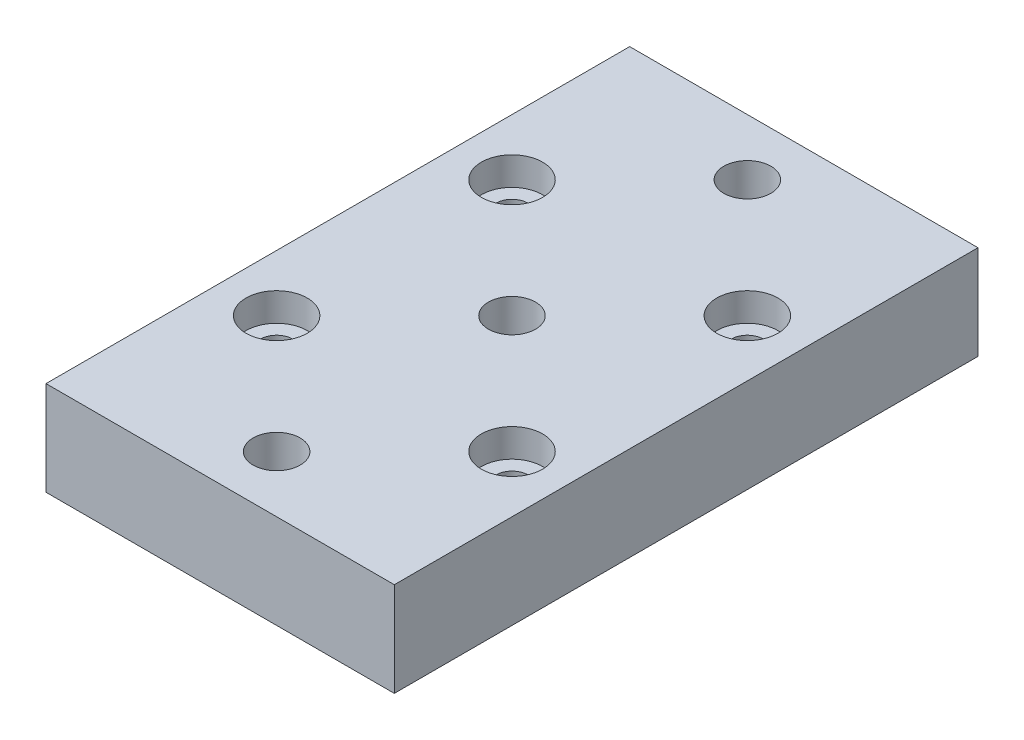
ISO-10303-21;
HEADER;
FILE_DESCRIPTION(('STEP AP214'),'2;1');
FILE_NAME('part.step','',(''),(''),'','','');
FILE_SCHEMA(('AUTOMOTIVE_DESIGN { 1 0 10303 214 1 1 1 1 }'));
ENDSEC;
DATA;
#1=APPLICATION_CONTEXT('core data for automotive mechanical design processes');
#2=APPLICATION_PROTOCOL_DEFINITION('international standard','automotive_design',2000,#1);
#3=PRODUCT_CONTEXT('',#1,'mechanical');
#4=PRODUCT('Part','Part','',(#3));
#5=PRODUCT_RELATED_PRODUCT_CATEGORY('part','',(#4));
#6=PRODUCT_DEFINITION_FORMATION('','',#4);
#7=PRODUCT_DEFINITION_CONTEXT('part definition',#1,'design');
#8=PRODUCT_DEFINITION('design','',#6,#7);
#9=PRODUCT_DEFINITION_SHAPE('','',#8);
#10=(LENGTH_UNIT() NAMED_UNIT(*) SI_UNIT(.MILLI.,.METRE.));
#11=(NAMED_UNIT(*) PLANE_ANGLE_UNIT() SI_UNIT($,.RADIAN.));
#12=(NAMED_UNIT(*) SI_UNIT($,.STERADIAN.) SOLID_ANGLE_UNIT());
#13=UNCERTAINTY_MEASURE_WITH_UNIT(LENGTH_MEASURE(1.E-05),#10,'distance_accuracy_value','');
#14=(GEOMETRIC_REPRESENTATION_CONTEXT(3) GLOBAL_UNCERTAINTY_ASSIGNED_CONTEXT((#13)) GLOBAL_UNIT_ASSIGNED_CONTEXT((#10,
#11,#12)) REPRESENTATION_CONTEXT('',''));
#15=CARTESIAN_POINT('',(0.,0.,0.));
#16=DIRECTION('',(0.,0.,1.));
#17=DIRECTION('',(1.,0.,0.));
#18=AXIS2_PLACEMENT_3D('',#15,#16,#17);
#19=CARTESIAN_POINT('',(18.5,10.,31.));
#20=DIRECTION('',(-1.,0.,0.));
#21=DIRECTION('',(0.,0.,1.));
#22=AXIS2_PLACEMENT_3D('',#19,#20,#21);
#23=PLANE('',#22);
#24=DIRECTION('',(0.,0.,-1.));
#25=VECTOR('',#24,1.);
#26=CARTESIAN_POINT('',(18.5,0.,31.));
#27=LINE('',#26,#25);
#28=CARTESIAN_POINT('',(18.5,0.,31.));
#29=VERTEX_POINT('',#28);
#30=CARTESIAN_POINT('',(18.5,0.,-31.));
#31=VERTEX_POINT('',#30);
#32=EDGE_CURVE('E96',#29,#31,#27,.T.);
#33=ORIENTED_EDGE('',*,*,#32,.T.);
#34=DIRECTION('',(0.,-1.,0.));
#35=VECTOR('',#34,1.);
#36=CARTESIAN_POINT('',(18.5,10.,-31.));
#37=LINE('',#36,#35);
#38=CARTESIAN_POINT('',(18.5,10.,-31.));
#39=VERTEX_POINT('',#38);
#40=EDGE_CURVE('E11',#39,#31,#37,.T.);
#41=ORIENTED_EDGE('',*,*,#40,.F.);
#42=DIRECTION('',(0.,0.,-1.));
#43=VECTOR('',#42,1.);
#44=CARTESIAN_POINT('',(18.5,10.,31.));
#45=LINE('',#44,#43);
#46=CARTESIAN_POINT('',(18.5,10.,31.));
#47=VERTEX_POINT('',#46);
#48=EDGE_CURVE('E84',#47,#39,#45,.T.);
#49=ORIENTED_EDGE('',*,*,#48,.F.);
#50=DIRECTION('',(0.,-1.,0.));
#51=VECTOR('',#50,1.);
#52=CARTESIAN_POINT('',(18.5,10.,31.));
#53=LINE('',#52,#51);
#54=EDGE_CURVE('E92',#47,#29,#53,.T.);
#55=ORIENTED_EDGE('',*,*,#54,.T.);
#56=EDGE_LOOP('',(#33,#41,#49,#55));
#57=FACE_BOUND('',#56,.T.);
#58=ADVANCED_FACE('F33',(#57),#23,.F.);
#59=CARTESIAN_POINT('',(-18.5,10.,-31.));
#60=DIRECTION('',(0.,0.,1.));
#61=DIRECTION('',(1.,0.,0.));
#62=AXIS2_PLACEMENT_3D('',#59,#60,#61);
#63=PLANE('',#62);
#64=DIRECTION('',(-1.,0.,0.));
#65=VECTOR('',#64,1.);
#66=CARTESIAN_POINT('',(-18.5,0.,-31.));
#67=LINE('',#66,#65);
#68=CARTESIAN_POINT('',(-18.5,0.,-31.));
#69=VERTEX_POINT('',#68);
#70=EDGE_CURVE('E88',#31,#69,#67,.T.);
#71=ORIENTED_EDGE('',*,*,#70,.T.);
#72=DIRECTION('',(0.,-1.,0.));
#73=VECTOR('',#72,1.);
#74=CARTESIAN_POINT('',(-18.5,10.,-31.));
#75=LINE('',#74,#73);
#76=CARTESIAN_POINT('',(-18.5,10.,-31.));
#77=VERTEX_POINT('',#76);
#78=EDGE_CURVE('E41',#77,#69,#75,.T.);
#79=ORIENTED_EDGE('',*,*,#78,.F.);
#80=DIRECTION('',(-1.,0.,0.));
#81=VECTOR('',#80,1.);
#82=CARTESIAN_POINT('',(-18.5,10.,-31.));
#83=LINE('',#82,#81);
#84=EDGE_CURVE('E79',#39,#77,#83,.T.);
#85=ORIENTED_EDGE('',*,*,#84,.F.);
#86=ORIENTED_EDGE('',*,*,#40,.T.);
#87=EDGE_LOOP('',(#71,#79,#85,#86));
#88=FACE_BOUND('',#87,.T.);
#89=ADVANCED_FACE('F87',(#88),#63,.F.);
#90=CARTESIAN_POINT('',(-18.5,10.,31.));
#91=DIRECTION('',(1.,0.,0.));
#92=DIRECTION('',(0.,0.,-1.));
#93=AXIS2_PLACEMENT_3D('',#90,#91,#92);
#94=PLANE('',#93);
#95=DIRECTION('',(0.,0.,1.));
#96=VECTOR('',#95,1.);
#97=CARTESIAN_POINT('',(-18.5,0.,31.));
#98=LINE('',#97,#96);
#99=CARTESIAN_POINT('',(-18.5,0.,31.));
#100=VERTEX_POINT('',#99);
#101=EDGE_CURVE('E66',#69,#100,#98,.T.);
#102=ORIENTED_EDGE('',*,*,#101,.T.);
#103=DIRECTION('',(0.,-1.,0.));
#104=VECTOR('',#103,1.);
#105=CARTESIAN_POINT('',(-18.5,10.,31.));
#106=LINE('',#105,#104);
#107=CARTESIAN_POINT('',(-18.5,10.,31.));
#108=VERTEX_POINT('',#107);
#109=EDGE_CURVE('E89',#108,#100,#106,.T.);
#110=ORIENTED_EDGE('',*,*,#109,.F.);
#111=DIRECTION('',(0.,0.,1.));
#112=VECTOR('',#111,1.);
#113=CARTESIAN_POINT('',(-18.5,10.,31.));
#114=LINE('',#113,#112);
#115=EDGE_CURVE('E82',#77,#108,#114,.T.);
#116=ORIENTED_EDGE('',*,*,#115,.F.);
#117=ORIENTED_EDGE('',*,*,#78,.T.);
#118=EDGE_LOOP('',(#102,#110,#116,#117));
#119=FACE_BOUND('',#118,.T.);
#120=ADVANCED_FACE('F90',(#119),#94,.F.);
#121=CARTESIAN_POINT('',(-18.5,10.,31.));
#122=DIRECTION('',(0.,0.,-1.));
#123=DIRECTION('',(-1.,0.,0.));
#124=AXIS2_PLACEMENT_3D('',#121,#122,#123);
#125=PLANE('',#124);
#126=DIRECTION('',(1.,0.,0.));
#127=VECTOR('',#126,1.);
#128=CARTESIAN_POINT('',(-18.5,0.,31.));
#129=LINE('',#128,#127);
#130=EDGE_CURVE('E72',#100,#29,#129,.T.);
#131=ORIENTED_EDGE('',*,*,#130,.T.);
#132=ORIENTED_EDGE('',*,*,#54,.F.);
#133=DIRECTION('',(1.,0.,0.));
#134=VECTOR('',#133,1.);
#135=CARTESIAN_POINT('',(-18.5,10.,31.));
#136=LINE('',#135,#134);
#137=EDGE_CURVE('E49',#108,#47,#136,.T.);
#138=ORIENTED_EDGE('',*,*,#137,.F.);
#139=ORIENTED_EDGE('',*,*,#109,.T.);
#140=EDGE_LOOP('',(#131,#132,#138,#139));
#141=FACE_BOUND('',#140,.T.);
#142=ADVANCED_FACE('F104',(#141),#125,.F.);
#143=CARTESIAN_POINT('',(18.5,10.,-31.));
#144=DIRECTION('',(0.,-1.,0.));
#145=DIRECTION('',(0.,0.,-1.));
#146=AXIS2_PLACEMENT_3D('',#143,#144,#145);
#147=PLANE('',#146);
#148=CARTESIAN_POINT('',(0.,10.,25.));
#149=DIRECTION('',(0.,-1.,0.));
#150=DIRECTION('',(0.,0.,-1.));
#151=AXIS2_PLACEMENT_3D('',#148,#149,#150);
#152=CIRCLE('',#151,2.49999999999999);
#153=CARTESIAN_POINT('',(0.,10.,22.5));
#154=VERTEX_POINT('',#153);
#155=EDGE_CURVE('E169',#154,#154,#152,.T.);
#156=ORIENTED_EDGE('',*,*,#155,.T.);
#157=EDGE_LOOP('',(#156));
#158=FACE_BOUND('',#157,.T.);
#159=CARTESIAN_POINT('',(0.,10.,0.));
#160=DIRECTION('',(0.,-1.,0.));
#161=DIRECTION('',(0.,0.,-1.));
#162=AXIS2_PLACEMENT_3D('',#159,#160,#161);
#163=CIRCLE('',#162,2.49999999999999);
#164=CARTESIAN_POINT('',(0.,10.,-2.49999999999999));
#165=VERTEX_POINT('',#164);
#166=EDGE_CURVE('E163',#165,#165,#163,.T.);
#167=ORIENTED_EDGE('',*,*,#166,.T.);
#168=EDGE_LOOP('',(#167));
#169=FACE_BOUND('',#168,.T.);
#170=CARTESIAN_POINT('',(0.,10.,-25.));
#171=DIRECTION('',(0.,-1.,0.));
#172=DIRECTION('',(0.,0.,-1.));
#173=AXIS2_PLACEMENT_3D('',#170,#171,#172);
#174=CIRCLE('',#173,2.49999999999999);
#175=CARTESIAN_POINT('',(0.,10.,-27.5));
#176=VERTEX_POINT('',#175);
#177=EDGE_CURVE('E157',#176,#176,#174,.T.);
#178=ORIENTED_EDGE('',*,*,#177,.T.);
#179=EDGE_LOOP('',(#178));
#180=FACE_BOUND('',#179,.T.);
#181=CARTESIAN_POINT('',(12.5,10.,12.5));
#182=DIRECTION('',(0.,1.,0.));
#183=DIRECTION('',(0.,0.,1.));
#184=AXIS2_PLACEMENT_3D('',#181,#182,#183);
#185=CIRCLE('',#184,3.25);
#186=CARTESIAN_POINT('',(12.5,10.,15.75));
#187=VERTEX_POINT('',#186);
#188=EDGE_CURVE('E154',#187,#187,#185,.T.);
#189=ORIENTED_EDGE('',*,*,#188,.F.);
#190=EDGE_LOOP('',(#189));
#191=FACE_BOUND('',#190,.T.);
#192=CARTESIAN_POINT('',(-12.5,10.,12.5));
#193=DIRECTION('',(0.,1.,0.));
#194=DIRECTION('',(0.,0.,1.));
#195=AXIS2_PLACEMENT_3D('',#192,#193,#194);
#196=CIRCLE('',#195,3.25);
#197=CARTESIAN_POINT('',(-12.5,10.,15.75));
#198=VERTEX_POINT('',#197);
#199=EDGE_CURVE('E142',#198,#198,#196,.T.);
#200=ORIENTED_EDGE('',*,*,#199,.F.);
#201=EDGE_LOOP('',(#200));
#202=FACE_BOUND('',#201,.T.);
#203=CARTESIAN_POINT('',(12.5,10.,-12.5));
#204=DIRECTION('',(0.,1.,0.));
#205=DIRECTION('',(0.,0.,1.));
#206=AXIS2_PLACEMENT_3D('',#203,#204,#205);
#207=CIRCLE('',#206,3.25);
#208=CARTESIAN_POINT('',(12.5,10.,-9.25000000000001));
#209=VERTEX_POINT('',#208);
#210=EDGE_CURVE('E130',#209,#209,#207,.T.);
#211=ORIENTED_EDGE('',*,*,#210,.F.);
#212=EDGE_LOOP('',(#211));
#213=FACE_BOUND('',#212,.T.);
#214=CARTESIAN_POINT('',(-12.5,10.,-12.5));
#215=DIRECTION('',(0.,1.,0.));
#216=DIRECTION('',(0.,0.,1.));
#217=AXIS2_PLACEMENT_3D('',#214,#215,#216);
#218=CIRCLE('',#217,3.25);
#219=CARTESIAN_POINT('',(-12.5,10.,-9.25000000000001));
#220=VERTEX_POINT('',#219);
#221=EDGE_CURVE('E118',#220,#220,#218,.T.);
#222=ORIENTED_EDGE('',*,*,#221,.F.);
#223=EDGE_LOOP('',(#222));
#224=FACE_BOUND('',#223,.T.);
#225=ORIENTED_EDGE('',*,*,#48,.T.);
#226=ORIENTED_EDGE('',*,*,#84,.T.);
#227=ORIENTED_EDGE('',*,*,#115,.T.);
#228=ORIENTED_EDGE('',*,*,#137,.T.);
#229=EDGE_LOOP('',(#225,#226,#227,#228));
#230=FACE_BOUND('',#229,.T.);
#231=ADVANCED_FACE('F80',(#158,#169,#180,#191,#202,#213,#224,#230),#147,.F.);
#232=CARTESIAN_POINT('',(18.5,0.,-31.));
#233=DIRECTION('',(0.,-1.,0.));
#234=DIRECTION('',(0.,0.,-1.));
#235=AXIS2_PLACEMENT_3D('',#232,#233,#234);
#236=PLANE('',#235);
#237=CARTESIAN_POINT('',(0.,0.,25.));
#238=DIRECTION('',(0.,-1.,0.));
#239=DIRECTION('',(0.,0.,-1.));
#240=AXIS2_PLACEMENT_3D('',#237,#238,#239);
#241=CIRCLE('',#240,2.49999999999999);
#242=CARTESIAN_POINT('',(0.,0.,22.5));
#243=VERTEX_POINT('',#242);
#244=EDGE_CURVE('E172',#243,#243,#241,.T.);
#245=ORIENTED_EDGE('',*,*,#244,.F.);
#246=EDGE_LOOP('',(#245));
#247=FACE_BOUND('',#246,.T.);
#248=CARTESIAN_POINT('',(0.,0.,0.));
#249=DIRECTION('',(0.,-1.,0.));
#250=DIRECTION('',(0.,0.,-1.));
#251=AXIS2_PLACEMENT_3D('',#248,#249,#250);
#252=CIRCLE('',#251,2.49999999999999);
#253=CARTESIAN_POINT('',(0.,0.,-2.49999999999999));
#254=VERTEX_POINT('',#253);
#255=EDGE_CURVE('E166',#254,#254,#252,.T.);
#256=ORIENTED_EDGE('',*,*,#255,.F.);
#257=EDGE_LOOP('',(#256));
#258=FACE_BOUND('',#257,.T.);
#259=CARTESIAN_POINT('',(0.,0.,-25.));
#260=DIRECTION('',(0.,-1.,0.));
#261=DIRECTION('',(0.,0.,-1.));
#262=AXIS2_PLACEMENT_3D('',#259,#260,#261);
#263=CIRCLE('',#262,2.49999999999999);
#264=CARTESIAN_POINT('',(0.,0.,-27.5));
#265=VERTEX_POINT('',#264);
#266=EDGE_CURVE('E160',#265,#265,#263,.T.);
#267=ORIENTED_EDGE('',*,*,#266,.F.);
#268=EDGE_LOOP('',(#267));
#269=FACE_BOUND('',#268,.T.);
#270=CARTESIAN_POINT('',(12.5,0.,12.5));
#271=DIRECTION('',(0.,1.,0.));
#272=DIRECTION('',(0.,0.,1.));
#273=AXIS2_PLACEMENT_3D('',#270,#271,#272);
#274=CIRCLE('',#273,1.7);
#275=CARTESIAN_POINT('',(12.5,0.,14.2));
#276=VERTEX_POINT('',#275);
#277=EDGE_CURVE('E145',#276,#276,#274,.T.);
#278=ORIENTED_EDGE('',*,*,#277,.T.);
#279=EDGE_LOOP('',(#278));
#280=FACE_BOUND('',#279,.T.);
#281=CARTESIAN_POINT('',(-12.5,0.,12.5));
#282=DIRECTION('',(0.,1.,0.));
#283=DIRECTION('',(0.,0.,1.));
#284=AXIS2_PLACEMENT_3D('',#281,#282,#283);
#285=CIRCLE('',#284,1.7);
#286=CARTESIAN_POINT('',(-12.5,0.,14.2));
#287=VERTEX_POINT('',#286);
#288=EDGE_CURVE('E133',#287,#287,#285,.T.);
#289=ORIENTED_EDGE('',*,*,#288,.T.);
#290=EDGE_LOOP('',(#289));
#291=FACE_BOUND('',#290,.T.);
#292=CARTESIAN_POINT('',(12.5,0.,-12.5));
#293=DIRECTION('',(0.,1.,0.));
#294=DIRECTION('',(0.,0.,1.));
#295=AXIS2_PLACEMENT_3D('',#292,#293,#294);
#296=CIRCLE('',#295,1.7);
#297=CARTESIAN_POINT('',(12.5,0.,-10.8));
#298=VERTEX_POINT('',#297);
#299=EDGE_CURVE('E121',#298,#298,#296,.T.);
#300=ORIENTED_EDGE('',*,*,#299,.T.);
#301=EDGE_LOOP('',(#300));
#302=FACE_BOUND('',#301,.T.);
#303=CARTESIAN_POINT('',(-12.5,0.,-12.5));
#304=DIRECTION('',(0.,1.,0.));
#305=DIRECTION('',(0.,0.,1.));
#306=AXIS2_PLACEMENT_3D('',#303,#304,#305);
#307=CIRCLE('',#306,1.7);
#308=CARTESIAN_POINT('',(-12.5,0.,-10.8));
#309=VERTEX_POINT('',#308);
#310=EDGE_CURVE('E99',#309,#309,#307,.T.);
#311=ORIENTED_EDGE('',*,*,#310,.T.);
#312=EDGE_LOOP('',(#311));
#313=FACE_BOUND('',#312,.T.);
#314=ORIENTED_EDGE('',*,*,#32,.F.);
#315=ORIENTED_EDGE('',*,*,#130,.F.);
#316=ORIENTED_EDGE('',*,*,#101,.F.);
#317=ORIENTED_EDGE('',*,*,#70,.F.);
#318=EDGE_LOOP('',(#314,#315,#316,#317));
#319=FACE_BOUND('',#318,.T.);
#320=ADVANCED_FACE('F107',(#247,#258,#269,#280,#291,#302,#313,#319),#236,.T.);
#321=CARTESIAN_POINT('',(-12.5,10.,-12.5));
#322=DIRECTION('',(0.,1.,0.));
#323=DIRECTION('',(0.,0.,1.));
#324=AXIS2_PLACEMENT_3D('',#321,#322,#323);
#325=CYLINDRICAL_SURFACE('',#324,1.7);
#326=ORIENTED_EDGE('',*,*,#310,.F.);
#327=EDGE_LOOP('',(#326));
#328=FACE_BOUND('',#327,.T.);
#329=CARTESIAN_POINT('',(-12.5,7.,-12.5));
#330=DIRECTION('',(0.,1.,0.));
#331=DIRECTION('',(0.,0.,1.));
#332=AXIS2_PLACEMENT_3D('',#329,#330,#331);
#333=CIRCLE('',#332,1.7);
#334=CARTESIAN_POINT('',(-12.5,7.,-10.8));
#335=VERTEX_POINT('',#334);
#336=EDGE_CURVE('E112',#335,#335,#333,.T.);
#337=ORIENTED_EDGE('',*,*,#336,.T.);
#338=EDGE_LOOP('',(#337));
#339=FACE_BOUND('',#338,.T.);
#340=ADVANCED_FACE('F181',(#328,#339),#325,.F.);
#341=CARTESIAN_POINT('',(-10.8,7.,-12.5));
#342=DIRECTION('',(0.,-1.,0.));
#343=DIRECTION('',(0.,0.,-1.));
#344=AXIS2_PLACEMENT_3D('',#341,#342,#343);
#345=PLANE('',#344);
#346=ORIENTED_EDGE('',*,*,#336,.F.);
#347=EDGE_LOOP('',(#346));
#348=FACE_BOUND('',#347,.T.);
#349=CARTESIAN_POINT('',(-12.5,7.,-12.5));
#350=DIRECTION('',(0.,1.,0.));
#351=DIRECTION('',(0.,0.,1.));
#352=AXIS2_PLACEMENT_3D('',#349,#350,#351);
#353=CIRCLE('',#352,3.25);
#354=CARTESIAN_POINT('',(-12.5,7.,-9.25000000000001));
#355=VERTEX_POINT('',#354);
#356=EDGE_CURVE('E115',#355,#355,#353,.T.);
#357=ORIENTED_EDGE('',*,*,#356,.T.);
#358=EDGE_LOOP('',(#357));
#359=FACE_BOUND('',#358,.T.);
#360=ADVANCED_FACE('F197',(#348,#359),#345,.F.);
#361=CARTESIAN_POINT('',(-12.5,10.,-12.5));
#362=DIRECTION('',(0.,1.,0.));
#363=DIRECTION('',(0.,0.,1.));
#364=AXIS2_PLACEMENT_3D('',#361,#362,#363);
#365=CYLINDRICAL_SURFACE('',#364,3.25);
#366=ORIENTED_EDGE('',*,*,#356,.F.);
#367=EDGE_LOOP('',(#366));
#368=FACE_BOUND('',#367,.T.);
#369=ORIENTED_EDGE('',*,*,#221,.T.);
#370=EDGE_LOOP('',(#369));
#371=FACE_BOUND('',#370,.T.);
#372=ADVANCED_FACE('F203',(#368,#371),#365,.F.);
#373=CARTESIAN_POINT('',(12.5,10.,-12.5));
#374=DIRECTION('',(0.,1.,0.));
#375=DIRECTION('',(0.,0.,1.));
#376=AXIS2_PLACEMENT_3D('',#373,#374,#375);
#377=CYLINDRICAL_SURFACE('',#376,1.7);
#378=ORIENTED_EDGE('',*,*,#299,.F.);
#379=EDGE_LOOP('',(#378));
#380=FACE_BOUND('',#379,.T.);
#381=CARTESIAN_POINT('',(12.5,7.,-12.5));
#382=DIRECTION('',(0.,1.,0.));
#383=DIRECTION('',(0.,0.,1.));
#384=AXIS2_PLACEMENT_3D('',#381,#382,#383);
#385=CIRCLE('',#384,1.7);
#386=CARTESIAN_POINT('',(12.5,7.,-10.8));
#387=VERTEX_POINT('',#386);
#388=EDGE_CURVE('E124',#387,#387,#385,.T.);
#389=ORIENTED_EDGE('',*,*,#388,.T.);
#390=EDGE_LOOP('',(#389));
#391=FACE_BOUND('',#390,.T.);
#392=ADVANCED_FACE('F209',(#380,#391),#377,.F.);
#393=CARTESIAN_POINT('',(14.2,7.,-12.5));
#394=DIRECTION('',(0.,-1.,0.));
#395=DIRECTION('',(0.,0.,-1.));
#396=AXIS2_PLACEMENT_3D('',#393,#394,#395);
#397=PLANE('',#396);
#398=ORIENTED_EDGE('',*,*,#388,.F.);
#399=EDGE_LOOP('',(#398));
#400=FACE_BOUND('',#399,.T.);
#401=CARTESIAN_POINT('',(12.5,7.,-12.5));
#402=DIRECTION('',(0.,1.,0.));
#403=DIRECTION('',(0.,0.,1.));
#404=AXIS2_PLACEMENT_3D('',#401,#402,#403);
#405=CIRCLE('',#404,3.25);
#406=CARTESIAN_POINT('',(12.5,7.,-9.25000000000001));
#407=VERTEX_POINT('',#406);
#408=EDGE_CURVE('E127',#407,#407,#405,.T.);
#409=ORIENTED_EDGE('',*,*,#408,.T.);
#410=EDGE_LOOP('',(#409));
#411=FACE_BOUND('',#410,.T.);
#412=ADVANCED_FACE('F264',(#400,#411),#397,.F.);
#413=CARTESIAN_POINT('',(12.5,10.,-12.5));
#414=DIRECTION('',(0.,1.,0.));
#415=DIRECTION('',(0.,0.,1.));
#416=AXIS2_PLACEMENT_3D('',#413,#414,#415);
#417=CYLINDRICAL_SURFACE('',#416,3.25);
#418=ORIENTED_EDGE('',*,*,#408,.F.);
#419=EDGE_LOOP('',(#418));
#420=FACE_BOUND('',#419,.T.);
#421=ORIENTED_EDGE('',*,*,#210,.T.);
#422=EDGE_LOOP('',(#421));
#423=FACE_BOUND('',#422,.T.);
#424=ADVANCED_FACE('F274',(#420,#423),#417,.F.);
#425=CARTESIAN_POINT('',(-12.5,10.,12.5));
#426=DIRECTION('',(0.,1.,0.));
#427=DIRECTION('',(0.,0.,1.));
#428=AXIS2_PLACEMENT_3D('',#425,#426,#427);
#429=CYLINDRICAL_SURFACE('',#428,1.7);
#430=ORIENTED_EDGE('',*,*,#288,.F.);
#431=EDGE_LOOP('',(#430));
#432=FACE_BOUND('',#431,.T.);
#433=CARTESIAN_POINT('',(-12.5,7.,12.5));
#434=DIRECTION('',(0.,1.,0.));
#435=DIRECTION('',(0.,0.,1.));
#436=AXIS2_PLACEMENT_3D('',#433,#434,#435);
#437=CIRCLE('',#436,1.7);
#438=CARTESIAN_POINT('',(-12.5,7.,14.2));
#439=VERTEX_POINT('',#438);
#440=EDGE_CURVE('E136',#439,#439,#437,.T.);
#441=ORIENTED_EDGE('',*,*,#440,.T.);
#442=EDGE_LOOP('',(#441));
#443=FACE_BOUND('',#442,.T.);
#444=ADVANCED_FACE('F284',(#432,#443),#429,.F.);
#445=CARTESIAN_POINT('',(-10.8,7.,12.5));
#446=DIRECTION('',(0.,-1.,0.));
#447=DIRECTION('',(0.,0.,-1.));
#448=AXIS2_PLACEMENT_3D('',#445,#446,#447);
#449=PLANE('',#448);
#450=ORIENTED_EDGE('',*,*,#440,.F.);
#451=EDGE_LOOP('',(#450));
#452=FACE_BOUND('',#451,.T.);
#453=CARTESIAN_POINT('',(-12.5,7.,12.5));
#454=DIRECTION('',(0.,1.,0.));
#455=DIRECTION('',(0.,0.,1.));
#456=AXIS2_PLACEMENT_3D('',#453,#454,#455);
#457=CIRCLE('',#456,3.25);
#458=CARTESIAN_POINT('',(-12.5,7.,15.75));
#459=VERTEX_POINT('',#458);
#460=EDGE_CURVE('E139',#459,#459,#457,.T.);
#461=ORIENTED_EDGE('',*,*,#460,.T.);
#462=EDGE_LOOP('',(#461));
#463=FACE_BOUND('',#462,.T.);
#464=ADVANCED_FACE('F294',(#452,#463),#449,.F.);
#465=CARTESIAN_POINT('',(-12.5,10.,12.5));
#466=DIRECTION('',(0.,1.,0.));
#467=DIRECTION('',(0.,0.,1.));
#468=AXIS2_PLACEMENT_3D('',#465,#466,#467);
#469=CYLINDRICAL_SURFACE('',#468,3.25);
#470=ORIENTED_EDGE('',*,*,#460,.F.);
#471=EDGE_LOOP('',(#470));
#472=FACE_BOUND('',#471,.T.);
#473=ORIENTED_EDGE('',*,*,#199,.T.);
#474=EDGE_LOOP('',(#473));
#475=FACE_BOUND('',#474,.T.);
#476=ADVANCED_FACE('F304',(#472,#475),#469,.F.);
#477=CARTESIAN_POINT('',(12.5,10.,12.5));
#478=DIRECTION('',(0.,1.,0.));
#479=DIRECTION('',(0.,0.,1.));
#480=AXIS2_PLACEMENT_3D('',#477,#478,#479);
#481=CYLINDRICAL_SURFACE('',#480,1.7);
#482=ORIENTED_EDGE('',*,*,#277,.F.);
#483=EDGE_LOOP('',(#482));
#484=FACE_BOUND('',#483,.T.);
#485=CARTESIAN_POINT('',(12.5,7.,12.5));
#486=DIRECTION('',(0.,1.,0.));
#487=DIRECTION('',(0.,0.,1.));
#488=AXIS2_PLACEMENT_3D('',#485,#486,#487);
#489=CIRCLE('',#488,1.7);
#490=CARTESIAN_POINT('',(12.5,7.,14.2));
#491=VERTEX_POINT('',#490);
#492=EDGE_CURVE('E148',#491,#491,#489,.T.);
#493=ORIENTED_EDGE('',*,*,#492,.T.);
#494=EDGE_LOOP('',(#493));
#495=FACE_BOUND('',#494,.T.);
#496=ADVANCED_FACE('F314',(#484,#495),#481,.F.);
#497=CARTESIAN_POINT('',(14.2,7.,12.5));
#498=DIRECTION('',(0.,-1.,0.));
#499=DIRECTION('',(0.,0.,-1.));
#500=AXIS2_PLACEMENT_3D('',#497,#498,#499);
#501=PLANE('',#500);
#502=ORIENTED_EDGE('',*,*,#492,.F.);
#503=EDGE_LOOP('',(#502));
#504=FACE_BOUND('',#503,.T.);
#505=CARTESIAN_POINT('',(12.5,7.,12.5));
#506=DIRECTION('',(0.,1.,0.));
#507=DIRECTION('',(0.,0.,1.));
#508=AXIS2_PLACEMENT_3D('',#505,#506,#507);
#509=CIRCLE('',#508,3.25);
#510=CARTESIAN_POINT('',(12.5,7.,15.75));
#511=VERTEX_POINT('',#510);
#512=EDGE_CURVE('E151',#511,#511,#509,.T.);
#513=ORIENTED_EDGE('',*,*,#512,.T.);
#514=EDGE_LOOP('',(#513));
#515=FACE_BOUND('',#514,.T.);
#516=ADVANCED_FACE('F324',(#504,#515),#501,.F.);
#517=CARTESIAN_POINT('',(12.5,10.,12.5));
#518=DIRECTION('',(0.,1.,0.));
#519=DIRECTION('',(0.,0.,1.));
#520=AXIS2_PLACEMENT_3D('',#517,#518,#519);
#521=CYLINDRICAL_SURFACE('',#520,3.25);
#522=ORIENTED_EDGE('',*,*,#512,.F.);
#523=EDGE_LOOP('',(#522));
#524=FACE_BOUND('',#523,.T.);
#525=ORIENTED_EDGE('',*,*,#188,.T.);
#526=EDGE_LOOP('',(#525));
#527=FACE_BOUND('',#526,.T.);
#528=ADVANCED_FACE('F334',(#524,#527),#521,.F.);
#529=CARTESIAN_POINT('',(0.,0.,-25.));
#530=DIRECTION('',(0.,-1.,0.));
#531=DIRECTION('',(0.,0.,-1.));
#532=AXIS2_PLACEMENT_3D('',#529,#530,#531);
#533=CYLINDRICAL_SURFACE('',#532,2.49999999999999);
#534=ORIENTED_EDGE('',*,*,#266,.T.);
#535=EDGE_LOOP('',(#534));
#536=FACE_BOUND('',#535,.T.);
#537=ORIENTED_EDGE('',*,*,#177,.F.);
#538=EDGE_LOOP('',(#537));
#539=FACE_BOUND('',#538,.T.);
#540=ADVANCED_FACE('F344',(#536,#539),#533,.F.);
#541=CARTESIAN_POINT('',(0.,0.,0.));
#542=DIRECTION('',(0.,-1.,0.));
#543=DIRECTION('',(0.,0.,-1.));
#544=AXIS2_PLACEMENT_3D('',#541,#542,#543);
#545=CYLINDRICAL_SURFACE('',#544,2.49999999999999);
#546=ORIENTED_EDGE('',*,*,#255,.T.);
#547=EDGE_LOOP('',(#546));
#548=FACE_BOUND('',#547,.T.);
#549=ORIENTED_EDGE('',*,*,#166,.F.);
#550=EDGE_LOOP('',(#549));
#551=FACE_BOUND('',#550,.T.);
#552=ADVANCED_FACE('F353',(#548,#551),#545,.F.);
#553=CARTESIAN_POINT('',(0.,0.,25.));
#554=DIRECTION('',(0.,-1.,0.));
#555=DIRECTION('',(0.,0.,-1.));
#556=AXIS2_PLACEMENT_3D('',#553,#554,#555);
#557=CYLINDRICAL_SURFACE('',#556,2.49999999999999);
#558=ORIENTED_EDGE('',*,*,#244,.T.);
#559=EDGE_LOOP('',(#558));
#560=FACE_BOUND('',#559,.T.);
#561=ORIENTED_EDGE('',*,*,#155,.F.);
#562=EDGE_LOOP('',(#561));
#563=FACE_BOUND('',#562,.T.);
#564=ADVANCED_FACE('F176',(#560,#563),#557,.F.);
#565=CLOSED_SHELL('',(#58,#89,#120,#142,#231,#320,#340,#360,#372,#392,#412,#424,#444,#464,#476,
#496,#516,#528,#540,#552,#564));
#566=MANIFOLD_SOLID_BREP('B2',#565);
#567=ADVANCED_BREP_SHAPE_REPRESENTATION('',(#18,#566),#14);
#568=SHAPE_DEFINITION_REPRESENTATION(#9,#567);
ENDSEC;
END-ISO-10303-21;
